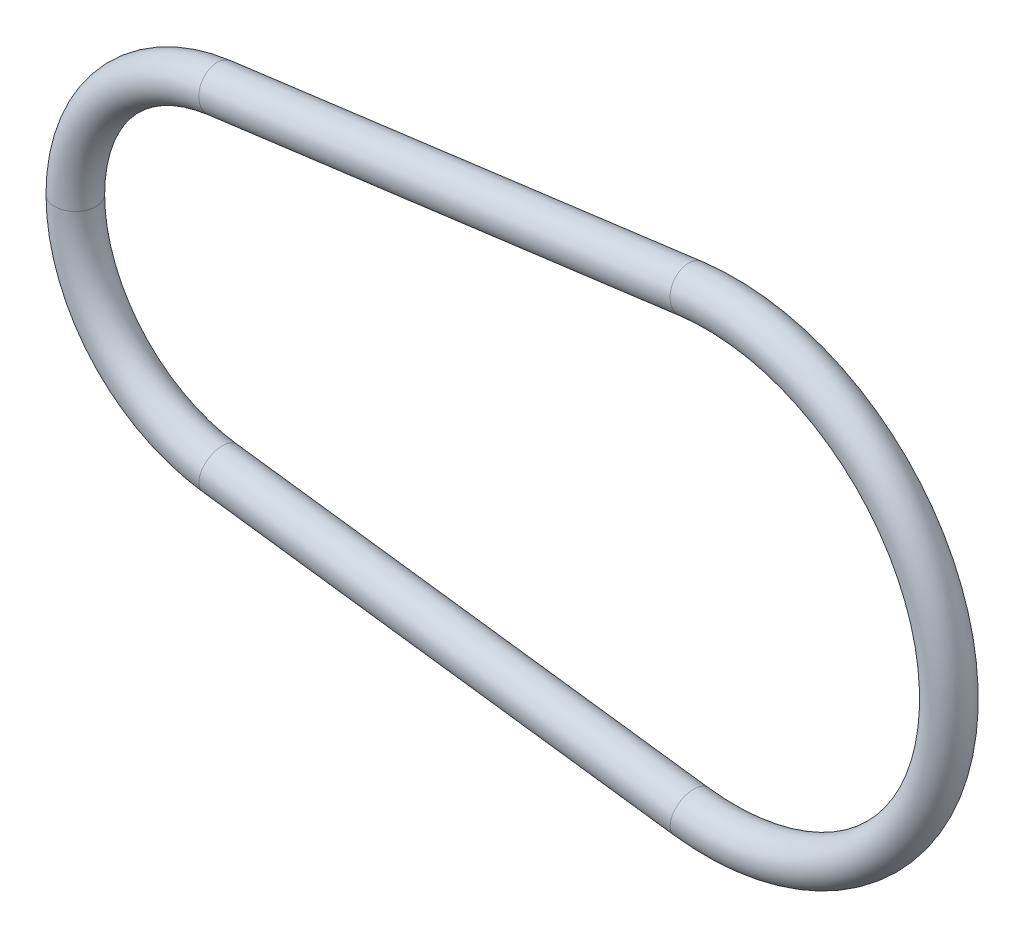
ISO-10303-21;
HEADER;
FILE_DESCRIPTION(('STEP AP214'),'2;1');
FILE_NAME('part.step','',(''),(''),'','','');
FILE_SCHEMA(('AUTOMOTIVE_DESIGN { 1 0 10303 214 1 1 1 1 }'));
ENDSEC;
DATA;
#1=APPLICATION_CONTEXT('core data for automotive mechanical design processes');
#2=APPLICATION_PROTOCOL_DEFINITION('international standard','automotive_design',2000,#1);
#3=PRODUCT_CONTEXT('',#1,'mechanical');
#4=PRODUCT('Part','Part','',(#3));
#5=PRODUCT_RELATED_PRODUCT_CATEGORY('part','',(#4));
#6=PRODUCT_DEFINITION_FORMATION('','',#4);
#7=PRODUCT_DEFINITION_CONTEXT('part definition',#1,'design');
#8=PRODUCT_DEFINITION('design','',#6,#7);
#9=PRODUCT_DEFINITION_SHAPE('','',#8);
#10=(LENGTH_UNIT() NAMED_UNIT(*) SI_UNIT(.MILLI.,.METRE.));
#11=(NAMED_UNIT(*) PLANE_ANGLE_UNIT() SI_UNIT($,.RADIAN.));
#12=(NAMED_UNIT(*) SI_UNIT($,.STERADIAN.) SOLID_ANGLE_UNIT());
#13=UNCERTAINTY_MEASURE_WITH_UNIT(LENGTH_MEASURE(1.E-05),#10,'distance_accuracy_value','');
#14=(GEOMETRIC_REPRESENTATION_CONTEXT(3) GLOBAL_UNCERTAINTY_ASSIGNED_CONTEXT((#13)) GLOBAL_UNIT_ASSIGNED_CONTEXT((#10,
#11,#12)) REPRESENTATION_CONTEXT('',''));
#15=CARTESIAN_POINT('',(0.,0.,0.));
#16=DIRECTION('',(0.,0.,1.));
#17=DIRECTION('',(1.,0.,0.));
#18=AXIS2_PLACEMENT_3D('',#15,#16,#17);
#19=CARTESIAN_POINT('',(0.,0.,0.));
#20=DIRECTION('',(0.,0.,-1.));
#21=DIRECTION('',(-1.,0.,0.));
#22=AXIS2_PLACEMENT_3D('',#19,#20,#21);
#23=TOROIDAL_SURFACE('',#22,16.,2.);
#24=CARTESIAN_POINT('',(-2.0776978880239,-15.8645255676336,0.));
#25=DIRECTION('',(-0.991532847977102,0.129856118001494,0.));
#26=DIRECTION('',(0.,0.,1.));
#27=AXIS2_PLACEMENT_3D('',#24,#25,#26);
#28=CIRCLE('',#27,2.);
#29=CARTESIAN_POINT('',(-2.33741012402689,-17.8475912635878,0.));
#30=VERTEX_POINT('',#29);
#31=EDGE_CURVE('E10',#30,#30,#28,.T.);
#32=CARTESIAN_POINT('',(-16.,0.,0.));
#33=DIRECTION('',(0.,1.,0.));
#34=DIRECTION('',(0.,0.,1.));
#35=AXIS2_PLACEMENT_3D('',#32,#33,#34);
#36=CIRCLE('',#35,2.);
#37=CARTESIAN_POINT('',(-18.,0.,0.));
#38=VERTEX_POINT('',#37);
#39=EDGE_CURVE('E50',#38,#38,#36,.T.);
#40=CARTESIAN_POINT('',(0.,0.,0.));
#41=DIRECTION('',(0.,0.,-1.));
#42=DIRECTION('',(-1.,0.,0.));
#43=AXIS2_PLACEMENT_3D('',#40,#41,#42);
#44=CIRCLE('',#43,18.);
#45=EDGE_CURVE('',#30,#38,#44,.T.);
#46=ORIENTED_EDGE('',*,*,#31,.T.);
#47=ORIENTED_EDGE('',*,*,#39,.F.);
#48=ORIENTED_EDGE('',*,*,#45,.T.);
#49=ORIENTED_EDGE('',*,*,#45,.F.);
#50=EDGE_LOOP('',(#46,#48,#47,#49));
#51=FACE_BOUND('',#50,.T.);
#52=ADVANCED_FACE('F31',(#51),#23,.T.);
#53=CARTESIAN_POINT('',(43.3481505239671,-21.8137226554962,0.));
#54=DIRECTION('',(-0.991532847977102,0.129856118001494,0.));
#55=DIRECTION('',(-0.129856118001494,-0.991532847977102,0.));
#56=AXIS2_PLACEMENT_3D('',#53,#54,#55);
#57=CYLINDRICAL_SURFACE('',#56,2.);
#58=ORIENTED_EDGE('',*,*,#31,.F.);
#59=EDGE_LOOP('',(#58));
#60=FACE_BOUND('',#59,.T.);
#61=CARTESIAN_POINT('',(43.3481505239671,-21.8137226554962,0.));
#62=DIRECTION('',(-0.991532847977102,0.129856118001494,0.));
#63=DIRECTION('',(0.,0.,1.));
#64=AXIS2_PLACEMENT_3D('',#61,#62,#63);
#65=CIRCLE('',#64,2.);
#66=CARTESIAN_POINT('',(43.0884382879641,-23.7967883514504,0.));
#67=VERTEX_POINT('',#66);
#68=EDGE_CURVE('E37',#67,#67,#65,.T.);
#69=ORIENTED_EDGE('',*,*,#68,.T.);
#70=EDGE_LOOP('',(#69));
#71=FACE_BOUND('',#70,.T.);
#72=ADVANCED_FACE('F57',(#60,#71),#57,.T.);
#73=CARTESIAN_POINT('',(46.20498512,0.,0.));
#74=DIRECTION('',(0.,0.,-1.));
#75=DIRECTION('',(-1.,0.,0.));
#76=AXIS2_PLACEMENT_3D('',#73,#74,#75);
#77=TOROIDAL_SURFACE('',#76,22.,2.);
#78=CARTESIAN_POINT('',(43.3481505239672,21.8137226554962,0.));
#79=DIRECTION('',(0.991532847977102,0.129856118001494,0.));
#80=DIRECTION('',(0.,0.,1.));
#81=AXIS2_PLACEMENT_3D('',#78,#79,#80);
#82=CIRCLE('',#81,2.);
#83=CARTESIAN_POINT('',(43.0884382879642,23.7967883514504,0.));
#84=VERTEX_POINT('',#83);
#85=EDGE_CURVE('E41',#84,#84,#82,.T.);
#86=CARTESIAN_POINT('',(46.20498512,0.,0.));
#87=DIRECTION('',(0.,0.,-1.));
#88=DIRECTION('',(-1.,0.,0.));
#89=AXIS2_PLACEMENT_3D('',#86,#87,#88);
#90=CIRCLE('',#89,24.);
#91=EDGE_CURVE('',#84,#67,#90,.T.);
#92=ORIENTED_EDGE('',*,*,#85,.T.);
#93=ORIENTED_EDGE('',*,*,#68,.F.);
#94=ORIENTED_EDGE('',*,*,#91,.T.);
#95=ORIENTED_EDGE('',*,*,#91,.F.);
#96=EDGE_LOOP('',(#92,#94,#93,#95));
#97=FACE_BOUND('',#96,.T.);
#98=ADVANCED_FACE('F61',(#97),#77,.T.);
#99=CARTESIAN_POINT('',(-2.0776978880239,15.8645255676336,0.));
#100=DIRECTION('',(0.991532847977102,0.129856118001494,0.));
#101=DIRECTION('',(-0.129856118001494,0.991532847977102,0.));
#102=AXIS2_PLACEMENT_3D('',#99,#100,#101);
#103=CYLINDRICAL_SURFACE('',#102,2.);
#104=ORIENTED_EDGE('',*,*,#85,.F.);
#105=EDGE_LOOP('',(#104));
#106=FACE_BOUND('',#105,.T.);
#107=CARTESIAN_POINT('',(-2.07769788802391,15.8645255676336,0.));
#108=DIRECTION('',(0.991532847977102,0.129856118001494,0.));
#109=DIRECTION('',(0.,0.,1.));
#110=AXIS2_PLACEMENT_3D('',#107,#108,#109);
#111=CIRCLE('',#110,2.);
#112=CARTESIAN_POINT('',(-2.33741012402689,17.8475912635878,0.));
#113=VERTEX_POINT('',#112);
#114=EDGE_CURVE('E45',#113,#113,#111,.T.);
#115=ORIENTED_EDGE('',*,*,#114,.T.);
#116=EDGE_LOOP('',(#115));
#117=FACE_BOUND('',#116,.T.);
#118=ADVANCED_FACE('F66',(#106,#117),#103,.T.);
#119=CARTESIAN_POINT('',(0.,0.,0.));
#120=DIRECTION('',(0.,0.,-1.));
#121=DIRECTION('',(-1.,0.,0.));
#122=AXIS2_PLACEMENT_3D('',#119,#120,#121);
#123=TOROIDAL_SURFACE('',#122,16.,2.);
#124=CARTESIAN_POINT('',(0.,0.,0.));
#125=DIRECTION('',(0.,0.,-1.));
#126=DIRECTION('',(-1.,0.,0.));
#127=AXIS2_PLACEMENT_3D('',#124,#125,#126);
#128=CIRCLE('',#127,18.);
#129=EDGE_CURVE('',#38,#113,#128,.T.);
#130=ORIENTED_EDGE('',*,*,#39,.T.);
#131=ORIENTED_EDGE('',*,*,#114,.F.);
#132=ORIENTED_EDGE('',*,*,#129,.T.);
#133=ORIENTED_EDGE('',*,*,#129,.F.);
#134=EDGE_LOOP('',(#130,#132,#131,#133));
#135=FACE_BOUND('',#134,.T.);
#136=ADVANCED_FACE('F54',(#135),#123,.T.);
#137=CLOSED_SHELL('',(#52,#72,#98,#118,#136));
#138=MANIFOLD_SOLID_BREP('B2',#137);
#139=ADVANCED_BREP_SHAPE_REPRESENTATION('',(#18,#138),#14);
#140=SHAPE_DEFINITION_REPRESENTATION(#9,#139);
ENDSEC;
END-ISO-10303-21;
